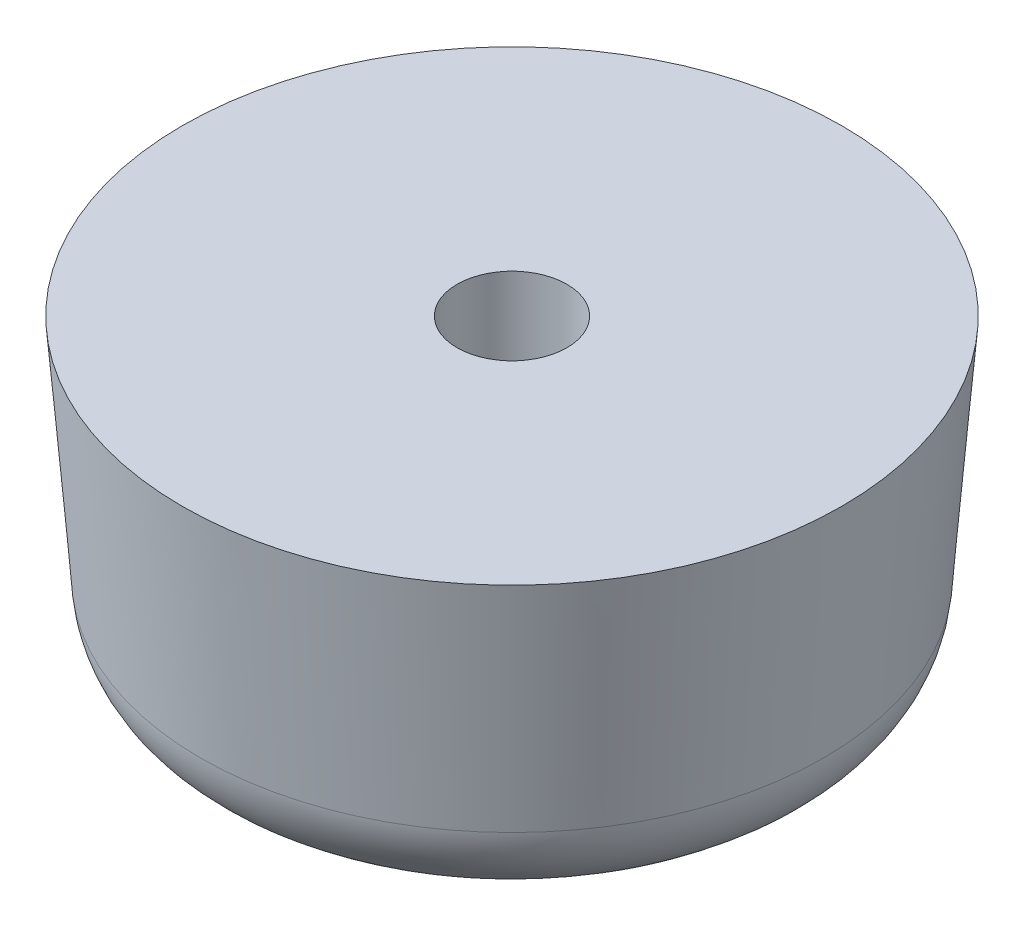
ISO-10303-21;
HEADER;
FILE_DESCRIPTION(('STEP AP214'),'2;1');
FILE_NAME('part.step','',(''),(''),'','','');
FILE_SCHEMA(('AUTOMOTIVE_DESIGN { 1 0 10303 214 1 1 1 1 }'));
ENDSEC;
DATA;
#1=APPLICATION_CONTEXT('core data for automotive mechanical design processes');
#2=APPLICATION_PROTOCOL_DEFINITION('international standard','automotive_design',2000,#1);
#3=PRODUCT_CONTEXT('',#1,'mechanical');
#4=PRODUCT('Part','Part','',(#3));
#5=PRODUCT_RELATED_PRODUCT_CATEGORY('part','',(#4));
#6=PRODUCT_DEFINITION_FORMATION('','',#4);
#7=PRODUCT_DEFINITION_CONTEXT('part definition',#1,'design');
#8=PRODUCT_DEFINITION('design','',#6,#7);
#9=PRODUCT_DEFINITION_SHAPE('','',#8);
#10=(LENGTH_UNIT() NAMED_UNIT(*) SI_UNIT(.MILLI.,.METRE.));
#11=(NAMED_UNIT(*) PLANE_ANGLE_UNIT() SI_UNIT($,.RADIAN.));
#12=(NAMED_UNIT(*) SI_UNIT($,.STERADIAN.) SOLID_ANGLE_UNIT());
#13=UNCERTAINTY_MEASURE_WITH_UNIT(LENGTH_MEASURE(1.E-05),#10,'distance_accuracy_value','');
#14=(GEOMETRIC_REPRESENTATION_CONTEXT(3) GLOBAL_UNCERTAINTY_ASSIGNED_CONTEXT((#13)) GLOBAL_UNIT_ASSIGNED_CONTEXT((#10,
#11,#12)) REPRESENTATION_CONTEXT('',''));
#15=CARTESIAN_POINT('',(0.,0.,0.));
#16=DIRECTION('',(0.,0.,1.));
#17=DIRECTION('',(1.,0.,0.));
#18=AXIS2_PLACEMENT_3D('',#15,#16,#17);
#19=CARTESIAN_POINT('',(0.,0.,0.));
#20=DIRECTION('',(0.,-1.,0.));
#21=DIRECTION('',(0.,0.,-1.));
#22=AXIS2_PLACEMENT_3D('',#19,#20,#21);
#23=CYLINDRICAL_SURFACE('',#22,8.5);
#24=CARTESIAN_POINT('',(0.,-8.,0.));
#25=DIRECTION('',(0.,-1.,0.));
#26=DIRECTION('',(0.,0.,-1.));
#27=AXIS2_PLACEMENT_3D('',#24,#25,#26);
#28=CIRCLE('',#27,8.5);
#29=CARTESIAN_POINT('',(0.,-8.,-8.5));
#30=VERTEX_POINT('',#29);
#31=CARTESIAN_POINT('',(0.,-8.,8.5));
#32=VERTEX_POINT('',#31);
#33=EDGE_CURVE('E41',#30,#32,#28,.T.);
#34=ORIENTED_EDGE('',*,*,#33,.F.);
#35=CARTESIAN_POINT('',(0.,-8.,0.));
#36=DIRECTION('',(0.,-1.,0.));
#37=DIRECTION('',(0.,0.,-1.));
#38=AXIS2_PLACEMENT_3D('',#35,#36,#37);
#39=CIRCLE('',#38,8.5);
#40=EDGE_CURVE('E132',#32,#30,#39,.T.);
#41=ORIENTED_EDGE('',*,*,#40,.F.);
#42=DIRECTION('',(0.,-1.,0.));
#43=VECTOR('',#42,1.);
#44=CARTESIAN_POINT('',(0.,0.,8.5));
#45=LINE('',#44,#43);
#46=CARTESIAN_POINT('',(0.,-17.,8.5));
#47=VERTEX_POINT('',#46);
#48=EDGE_CURVE('E11',#32,#47,#45,.T.);
#49=ORIENTED_EDGE('',*,*,#48,.T.);
#50=CARTESIAN_POINT('',(0.,-17.,0.));
#51=DIRECTION('',(0.,-1.,0.));
#52=DIRECTION('',(0.,0.,-1.));
#53=AXIS2_PLACEMENT_3D('',#50,#51,#52);
#54=CIRCLE('',#53,8.5);
#55=CARTESIAN_POINT('',(0.,-17.,-8.5));
#56=VERTEX_POINT('',#55);
#57=EDGE_CURVE('E27',#47,#56,#54,.T.);
#58=ORIENTED_EDGE('',*,*,#57,.T.);
#59=CARTESIAN_POINT('',(0.,-17.,0.));
#60=DIRECTION('',(0.,-1.,0.));
#61=DIRECTION('',(0.,0.,-1.));
#62=AXIS2_PLACEMENT_3D('',#59,#60,#61);
#63=CIRCLE('',#62,8.5);
#64=EDGE_CURVE('E143',#56,#47,#63,.T.);
#65=ORIENTED_EDGE('',*,*,#64,.T.);
#66=ORIENTED_EDGE('',*,*,#48,.F.);
#67=EDGE_LOOP('',(#34,#41,#49,#58,#65,#66));
#68=FACE_BOUND('',#67,.T.);
#69=ADVANCED_FACE('F16',(#68),#23,.F.);
#70=CARTESIAN_POINT('',(0.,0.,0.));
#71=DIRECTION('',(0.,-1.,0.));
#72=DIRECTION('',(0.,0.,-1.));
#73=AXIS2_PLACEMENT_3D('',#70,#71,#72);
#74=CYLINDRICAL_SURFACE('',#73,3.);
#75=CARTESIAN_POINT('',(0.,0.,0.));
#76=DIRECTION('',(0.,-1.,0.));
#77=DIRECTION('',(0.,0.,-1.));
#78=AXIS2_PLACEMENT_3D('',#75,#76,#77);
#79=CIRCLE('',#78,3.);
#80=CARTESIAN_POINT('',(0.,0.,-3.));
#81=VERTEX_POINT('',#80);
#82=CARTESIAN_POINT('',(0.,0.,3.));
#83=VERTEX_POINT('',#82);
#84=EDGE_CURVE('E65',#81,#83,#79,.T.);
#85=ORIENTED_EDGE('',*,*,#84,.F.);
#86=CARTESIAN_POINT('',(0.,0.,0.));
#87=DIRECTION('',(0.,-1.,0.));
#88=DIRECTION('',(0.,0.,-1.));
#89=AXIS2_PLACEMENT_3D('',#86,#87,#88);
#90=CIRCLE('',#89,3.);
#91=EDGE_CURVE('E20',#83,#81,#90,.T.);
#92=ORIENTED_EDGE('',*,*,#91,.F.);
#93=DIRECTION('',(0.,-1.,0.));
#94=VECTOR('',#93,1.);
#95=CARTESIAN_POINT('',(0.,0.,3.));
#96=LINE('',#95,#94);
#97=CARTESIAN_POINT('',(0.,-8.,3.));
#98=VERTEX_POINT('',#97);
#99=EDGE_CURVE('E140',#83,#98,#96,.T.);
#100=ORIENTED_EDGE('',*,*,#99,.T.);
#101=CARTESIAN_POINT('',(0.,-8.,0.));
#102=DIRECTION('',(0.,-1.,0.));
#103=DIRECTION('',(0.,0.,-1.));
#104=AXIS2_PLACEMENT_3D('',#101,#102,#103);
#105=CIRCLE('',#104,3.);
#106=CARTESIAN_POINT('',(0.,-8.,-3.));
#107=VERTEX_POINT('',#106);
#108=EDGE_CURVE('E131',#98,#107,#105,.T.);
#109=ORIENTED_EDGE('',*,*,#108,.T.);
#110=CARTESIAN_POINT('',(0.,-8.,0.));
#111=DIRECTION('',(0.,-1.,0.));
#112=DIRECTION('',(0.,0.,-1.));
#113=AXIS2_PLACEMENT_3D('',#110,#111,#112);
#114=CIRCLE('',#113,3.);
#115=EDGE_CURVE('E117',#107,#98,#114,.T.);
#116=ORIENTED_EDGE('',*,*,#115,.T.);
#117=ORIENTED_EDGE('',*,*,#99,.F.);
#118=EDGE_LOOP('',(#85,#92,#100,#109,#116,#117));
#119=FACE_BOUND('',#118,.T.);
#120=ADVANCED_FACE('F174',(#119),#74,.F.);
#121=CARTESIAN_POINT('',(0.,-12.4018610268559,0.));
#122=DIRECTION('',(0.,1.,0.));
#123=DIRECTION('',(0.,0.,1.));
#124=AXIS2_PLACEMENT_3D('',#121,#122,#123);
#125=CONICAL_SURFACE('',#124,17.,0.0804589878137042);
#126=CARTESIAN_POINT('',(0.,0.,0.));
#127=DIRECTION('',(0.,-1.,0.));
#128=DIRECTION('',(0.,0.,-1.));
#129=AXIS2_PLACEMENT_3D('',#126,#127,#128);
#130=CIRCLE('',#129,18.);
#131=CARTESIAN_POINT('',(0.,0.,18.));
#132=VERTEX_POINT('',#131);
#133=CARTESIAN_POINT('',(0.,0.,-18.));
#134=VERTEX_POINT('',#133);
#135=EDGE_CURVE('E113',#132,#134,#130,.T.);
#136=ORIENTED_EDGE('',*,*,#135,.T.);
#137=DIRECTION('',(0.,-0.996764921435227,0.0803722053711744));
#138=VECTOR('',#137,1.);
#139=CARTESIAN_POINT('',(0.,-12.4018610268559,-17.));
#140=LINE('',#139,#138);
#141=CARTESIAN_POINT('',(0.,-12.4018610268559,-17.));
#142=VERTEX_POINT('',#141);
#143=EDGE_CURVE('E106',#134,#142,#140,.T.);
#144=ORIENTED_EDGE('',*,*,#143,.T.);
#145=CARTESIAN_POINT('',(0.,-12.4018610268559,0.));
#146=DIRECTION('',(0.,-1.,0.));
#147=DIRECTION('',(0.,0.,-1.));
#148=AXIS2_PLACEMENT_3D('',#145,#146,#147);
#149=CIRCLE('',#148,17.);
#150=CARTESIAN_POINT('',(0.,-12.4018610268559,17.));
#151=VERTEX_POINT('',#150);
#152=EDGE_CURVE('E98',#151,#142,#149,.T.);
#153=ORIENTED_EDGE('',*,*,#152,.F.);
#154=CARTESIAN_POINT('',(0.,-12.4018610268559,0.));
#155=DIRECTION('',(0.,-1.,0.));
#156=DIRECTION('',(0.,0.,-1.));
#157=AXIS2_PLACEMENT_3D('',#154,#155,#156);
#158=CIRCLE('',#157,17.);
#159=EDGE_CURVE('E111',#142,#151,#158,.T.);
#160=ORIENTED_EDGE('',*,*,#159,.F.);
#161=ORIENTED_EDGE('',*,*,#143,.F.);
#162=CARTESIAN_POINT('',(0.,0.,0.));
#163=DIRECTION('',(0.,-1.,0.));
#164=DIRECTION('',(0.,0.,-1.));
#165=AXIS2_PLACEMENT_3D('',#162,#163,#164);
#166=CIRCLE('',#165,18.);
#167=EDGE_CURVE('E110',#134,#132,#166,.T.);
#168=ORIENTED_EDGE('',*,*,#167,.T.);
#169=EDGE_LOOP('',(#136,#144,#153,#160,#161,#168));
#170=FACE_BOUND('',#169,.T.);
#171=ADVANCED_FACE('F108',(#170),#125,.T.);
#172=CARTESIAN_POINT('',(0.,-12.,0.));
#173=DIRECTION('',(0.,-1.,0.));
#174=DIRECTION('',(0.,0.,-1.));
#175=AXIS2_PLACEMENT_3D('',#172,#173,#174);
#176=TOROIDAL_SURFACE('',#175,12.0161753928239,5.);
#177=CARTESIAN_POINT('',(0.,-17.,0.));
#178=DIRECTION('',(0.,-1.,0.));
#179=DIRECTION('',(0.,0.,-1.));
#180=AXIS2_PLACEMENT_3D('',#177,#178,#179);
#181=CIRCLE('',#180,12.0161753928239);
#182=CARTESIAN_POINT('',(0.,-17.,-12.0161753928239));
#183=VERTEX_POINT('',#182);
#184=CARTESIAN_POINT('',(0.,-17.,12.0161753928239));
#185=VERTEX_POINT('',#184);
#186=EDGE_CURVE('E135',#183,#185,#181,.T.);
#187=ORIENTED_EDGE('',*,*,#186,.F.);
#188=CARTESIAN_POINT('',(0.,-17.,0.));
#189=DIRECTION('',(0.,-1.,0.));
#190=DIRECTION('',(0.,0.,-1.));
#191=AXIS2_PLACEMENT_3D('',#188,#189,#190);
#192=CIRCLE('',#191,12.0161753928239);
#193=EDGE_CURVE('E147',#185,#183,#192,.T.);
#194=ORIENTED_EDGE('',*,*,#193,.F.);
#195=CARTESIAN_POINT('',(0.,-12.,12.0161753928239));
#196=DIRECTION('',(-1.,0.,0.));
#197=DIRECTION('',(0.,0.,1.));
#198=AXIS2_PLACEMENT_3D('',#195,#196,#197);
#199=CIRCLE('',#198,5.);
#200=EDGE_CURVE('E122',#185,#151,#199,.T.);
#201=ORIENTED_EDGE('',*,*,#200,.T.);
#202=ORIENTED_EDGE('',*,*,#152,.T.);
#203=ORIENTED_EDGE('',*,*,#159,.T.);
#204=ORIENTED_EDGE('',*,*,#200,.F.);
#205=EDGE_LOOP('',(#187,#194,#201,#202,#203,#204));
#206=FACE_BOUND('',#205,.T.);
#207=ADVANCED_FACE('F18',(#206),#176,.T.);
#208=CARTESIAN_POINT('',(0.,0.,-18.));
#209=DIRECTION('',(0.,1.,0.));
#210=DIRECTION('',(1.,0.,0.));
#211=AXIS2_PLACEMENT_3D('',#208,#209,#210);
#212=PLANE('',#211);
#213=ORIENTED_EDGE('',*,*,#135,.F.);
#214=ORIENTED_EDGE('',*,*,#167,.F.);
#215=EDGE_LOOP('',(#213,#214));
#216=FACE_BOUND('',#215,.T.);
#217=ORIENTED_EDGE('',*,*,#84,.T.);
#218=ORIENTED_EDGE('',*,*,#91,.T.);
#219=EDGE_LOOP('',(#217,#218));
#220=FACE_BOUND('',#219,.T.);
#221=ADVANCED_FACE('F119',(#216,#220),#212,.T.);
#222=CARTESIAN_POINT('',(0.,-8.,-8.5));
#223=DIRECTION('',(0.,-1.,0.));
#224=DIRECTION('',(0.,0.,-1.));
#225=AXIS2_PLACEMENT_3D('',#222,#223,#224);
#226=PLANE('',#225);
#227=ORIENTED_EDGE('',*,*,#33,.T.);
#228=ORIENTED_EDGE('',*,*,#40,.T.);
#229=EDGE_LOOP('',(#227,#228));
#230=FACE_BOUND('',#229,.T.);
#231=ORIENTED_EDGE('',*,*,#115,.F.);
#232=ORIENTED_EDGE('',*,*,#108,.F.);
#233=EDGE_LOOP('',(#231,#232));
#234=FACE_BOUND('',#233,.T.);
#235=ADVANCED_FACE('F176',(#230,#234),#226,.T.);
#236=CARTESIAN_POINT('',(0.,-17.,-12.0161753928239));
#237=DIRECTION('',(0.,-1.,0.));
#238=DIRECTION('',(0.,0.,-1.));
#239=AXIS2_PLACEMENT_3D('',#236,#237,#238);
#240=PLANE('',#239);
#241=ORIENTED_EDGE('',*,*,#186,.T.);
#242=ORIENTED_EDGE('',*,*,#193,.T.);
#243=EDGE_LOOP('',(#241,#242));
#244=FACE_BOUND('',#243,.T.);
#245=ORIENTED_EDGE('',*,*,#64,.F.);
#246=ORIENTED_EDGE('',*,*,#57,.F.);
#247=EDGE_LOOP('',(#245,#246));
#248=FACE_BOUND('',#247,.T.);
#249=ADVANCED_FACE('F178',(#244,#248),#240,.T.);
#250=CLOSED_SHELL('',(#69,#120,#171,#207,#221,#235,#249));
#251=MANIFOLD_SOLID_BREP('B1',#250);
#252=ADVANCED_BREP_SHAPE_REPRESENTATION('',(#18,#251),#14);
#253=SHAPE_DEFINITION_REPRESENTATION(#9,#252);
ENDSEC;
END-ISO-10303-21;
